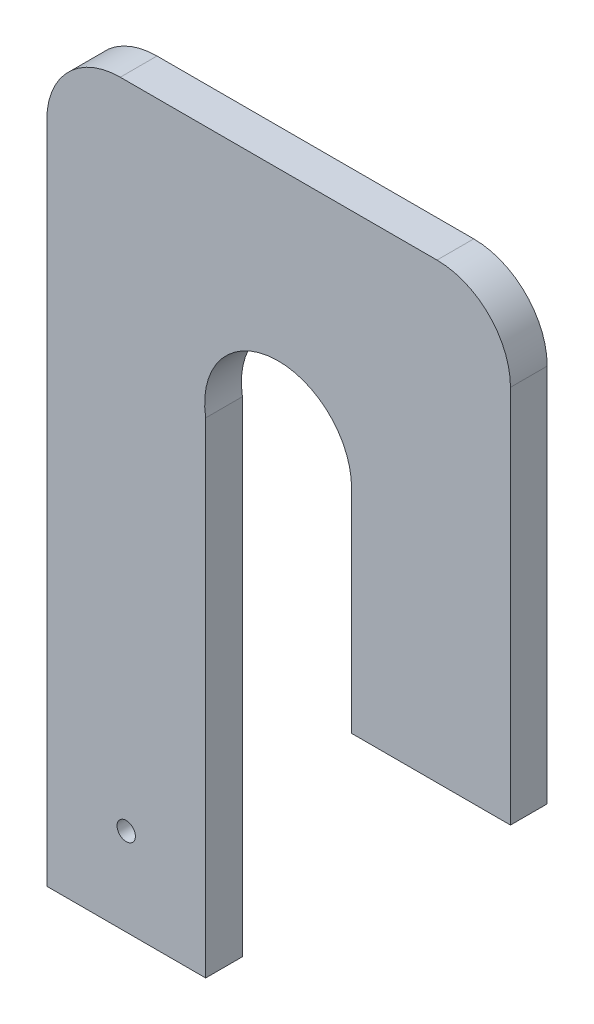
ISO-10303-21;
HEADER;
FILE_DESCRIPTION(('STEP AP214'),'2;1');
FILE_NAME('part.step','',(''),(''),'','','');
FILE_SCHEMA(('AUTOMOTIVE_DESIGN { 1 0 10303 214 1 1 1 1 }'));
ENDSEC;
DATA;
#1=APPLICATION_CONTEXT('core data for automotive mechanical design processes');
#2=APPLICATION_PROTOCOL_DEFINITION('international standard','automotive_design',2000,#1);
#3=PRODUCT_CONTEXT('',#1,'mechanical');
#4=PRODUCT('Part','Part','',(#3));
#5=PRODUCT_RELATED_PRODUCT_CATEGORY('part','',(#4));
#6=PRODUCT_DEFINITION_FORMATION('','',#4);
#7=PRODUCT_DEFINITION_CONTEXT('part definition',#1,'design');
#8=PRODUCT_DEFINITION('design','',#6,#7);
#9=PRODUCT_DEFINITION_SHAPE('','',#8);
#10=(LENGTH_UNIT() NAMED_UNIT(*) SI_UNIT(.MILLI.,.METRE.));
#11=(NAMED_UNIT(*) PLANE_ANGLE_UNIT() SI_UNIT($,.RADIAN.));
#12=(NAMED_UNIT(*) SI_UNIT($,.STERADIAN.) SOLID_ANGLE_UNIT());
#13=UNCERTAINTY_MEASURE_WITH_UNIT(LENGTH_MEASURE(1.E-05),#10,'distance_accuracy_value','');
#14=(GEOMETRIC_REPRESENTATION_CONTEXT(3) GLOBAL_UNCERTAINTY_ASSIGNED_CONTEXT((#13)) GLOBAL_UNIT_ASSIGNED_CONTEXT((#10,
#11,#12)) REPRESENTATION_CONTEXT('',''));
#15=CARTESIAN_POINT('',(0.,0.,0.));
#16=DIRECTION('',(0.,0.,1.));
#17=DIRECTION('',(1.,0.,0.));
#18=AXIS2_PLACEMENT_3D('',#15,#16,#17);
#19=CARTESIAN_POINT('',(25.0485915189549,171.916447250217,12.7));
#20=DIRECTION('',(0.,0.,-1.));
#21=DIRECTION('',(-1.,0.,0.));
#22=AXIS2_PLACEMENT_3D('',#19,#20,#21);
#23=CYLINDRICAL_SURFACE('',#22,25.4);
#24=CARTESIAN_POINT('',(25.0485915189549,171.916447250217,0.));
#25=DIRECTION('',(0.,0.,-1.));
#26=DIRECTION('',(-1.,0.,0.));
#27=AXIS2_PLACEMENT_3D('',#24,#25,#26);
#28=CIRCLE('',#27,25.4);
#29=CARTESIAN_POINT('',(0.,167.705976621351,0.));
#30=VERTEX_POINT('',#29);
#31=CARTESIAN_POINT('',(50.4485915189548,171.916447250217,0.));
#32=VERTEX_POINT('',#31);
#33=EDGE_CURVE('E141',#30,#32,#28,.T.);
#34=ORIENTED_EDGE('',*,*,#33,.T.);
#35=DIRECTION('',(0.,0.,-1.));
#36=VECTOR('',#35,1.);
#37=CARTESIAN_POINT('',(50.4485915189548,171.916447250217,12.7));
#38=LINE('',#37,#36);
#39=CARTESIAN_POINT('',(50.4485915189548,171.916447250217,12.7));
#40=VERTEX_POINT('',#39);
#41=EDGE_CURVE('E120',#40,#32,#38,.T.);
#42=ORIENTED_EDGE('',*,*,#41,.F.);
#43=CARTESIAN_POINT('',(25.0485915189549,171.916447250217,12.7));
#44=DIRECTION('',(0.,0.,-1.));
#45=DIRECTION('',(-1.,0.,0.));
#46=AXIS2_PLACEMENT_3D('',#43,#44,#45);
#47=CIRCLE('',#46,25.4);
#48=CARTESIAN_POINT('',(0.,167.705976621351,12.7));
#49=VERTEX_POINT('',#48);
#50=EDGE_CURVE('E128',#49,#40,#47,.T.);
#51=ORIENTED_EDGE('',*,*,#50,.F.);
#52=DIRECTION('',(0.,0.,-1.));
#53=VECTOR('',#52,1.);
#54=CARTESIAN_POINT('',(0.,167.705976621351,12.7));
#55=LINE('',#54,#53);
#56=EDGE_CURVE('E197',#49,#30,#55,.T.);
#57=ORIENTED_EDGE('',*,*,#56,.T.);
#58=EDGE_LOOP('',(#34,#42,#51,#57));
#59=FACE_BOUND('',#58,.T.);
#60=ADVANCED_FACE('F39',(#59),#23,.F.);
#61=CARTESIAN_POINT('',(50.4485915189548,171.916447250217,12.7));
#62=DIRECTION('',(1.,0.,0.));
#63=DIRECTION('',(0.,1.,0.));
#64=AXIS2_PLACEMENT_3D('',#61,#62,#63);
#65=PLANE('',#64);
#66=DIRECTION('',(0.,-1.,0.));
#67=VECTOR('',#66,1.);
#68=CARTESIAN_POINT('',(50.4485915189548,171.916447250217,0.));
#69=LINE('',#68,#67);
#70=CARTESIAN_POINT('',(50.4485915189549,98.4645123104404,0.));
#71=VERTEX_POINT('',#70);
#72=EDGE_CURVE('E217',#32,#71,#69,.T.);
#73=ORIENTED_EDGE('',*,*,#72,.T.);
#74=DIRECTION('',(0.,0.,-1.));
#75=VECTOR('',#74,1.);
#76=CARTESIAN_POINT('',(50.4485915189549,98.4645123104404,12.7));
#77=LINE('',#76,#75);
#78=CARTESIAN_POINT('',(50.4485915189549,98.4645123104404,12.7));
#79=VERTEX_POINT('',#78);
#80=EDGE_CURVE('E123',#79,#71,#77,.T.);
#81=ORIENTED_EDGE('',*,*,#80,.F.);
#82=DIRECTION('',(0.,-1.,0.));
#83=VECTOR('',#82,1.);
#84=CARTESIAN_POINT('',(50.4485915189548,171.916447250217,12.7));
#85=LINE('',#84,#83);
#86=EDGE_CURVE('E116',#40,#79,#85,.T.);
#87=ORIENTED_EDGE('',*,*,#86,.F.);
#88=ORIENTED_EDGE('',*,*,#41,.T.);
#89=EDGE_LOOP('',(#73,#81,#87,#88));
#90=FACE_BOUND('',#89,.T.);
#91=ADVANCED_FACE('F118',(#90),#65,.F.);
#92=CARTESIAN_POINT('',(50.4485915189549,98.4645123104404,12.7));
#93=DIRECTION('',(0.,1.,0.));
#94=DIRECTION('',(0.,0.,1.));
#95=AXIS2_PLACEMENT_3D('',#92,#93,#94);
#96=PLANE('',#95);
#97=DIRECTION('',(1.,0.,0.));
#98=VECTOR('',#97,1.);
#99=CARTESIAN_POINT('',(50.4485915189549,98.4645123104404,0.));
#100=LINE('',#99,#98);
#101=CARTESIAN_POINT('',(105.373327069566,98.4645123104404,0.));
#102=VERTEX_POINT('',#101);
#103=EDGE_CURVE('E189',#71,#102,#100,.T.);
#104=ORIENTED_EDGE('',*,*,#103,.T.);
#105=DIRECTION('',(0.,0.,-1.));
#106=VECTOR('',#105,1.);
#107=CARTESIAN_POINT('',(105.373327069566,98.4645123104404,12.7));
#108=LINE('',#107,#106);
#109=CARTESIAN_POINT('',(105.373327069566,98.4645123104404,12.7));
#110=VERTEX_POINT('',#109);
#111=EDGE_CURVE('E150',#110,#102,#108,.T.);
#112=ORIENTED_EDGE('',*,*,#111,.F.);
#113=DIRECTION('',(1.,0.,0.));
#114=VECTOR('',#113,1.);
#115=CARTESIAN_POINT('',(50.4485915189549,98.4645123104404,12.7));
#116=LINE('',#115,#114);
#117=EDGE_CURVE('E127',#79,#110,#116,.T.);
#118=ORIENTED_EDGE('',*,*,#117,.F.);
#119=ORIENTED_EDGE('',*,*,#80,.T.);
#120=EDGE_LOOP('',(#104,#112,#118,#119));
#121=FACE_BOUND('',#120,.T.);
#122=ADVANCED_FACE('F214',(#121),#96,.F.);
#123=CARTESIAN_POINT('',(105.373327069566,254.937244280116,12.7));
#124=DIRECTION('',(-1.,0.,0.));
#125=DIRECTION('',(0.,0.,1.));
#126=AXIS2_PLACEMENT_3D('',#123,#124,#125);
#127=PLANE('',#126);
#128=DIRECTION('',(0.,1.,0.));
#129=VECTOR('',#128,1.);
#130=CARTESIAN_POINT('',(105.373327069566,254.937244280116,0.));
#131=LINE('',#130,#129);
#132=CARTESIAN_POINT('',(105.373327069566,229.537244280116,0.));
#133=VERTEX_POINT('',#132);
#134=EDGE_CURVE('E183',#102,#133,#131,.T.);
#135=ORIENTED_EDGE('',*,*,#134,.T.);
#136=DIRECTION('',(0.,0.,-1.));
#137=VECTOR('',#136,1.);
#138=CARTESIAN_POINT('',(105.373327069566,229.537244280116,12.7));
#139=LINE('',#138,#137);
#140=CARTESIAN_POINT('',(105.373327069566,229.537244280116,12.7));
#141=VERTEX_POINT('',#140);
#142=EDGE_CURVE('E48',#133,#141,#139,.F.);
#143=ORIENTED_EDGE('',*,*,#142,.T.);
#144=DIRECTION('',(0.,1.,0.));
#145=VECTOR('',#144,1.);
#146=CARTESIAN_POINT('',(105.373327069566,98.4645123104404,12.7));
#147=LINE('',#146,#145);
#148=EDGE_CURVE('E211',#110,#141,#147,.T.);
#149=ORIENTED_EDGE('',*,*,#148,.F.);
#150=ORIENTED_EDGE('',*,*,#111,.T.);
#151=EDGE_LOOP('',(#135,#143,#149,#150));
#152=FACE_BOUND('',#151,.T.);
#153=ADVANCED_FACE('F210',(#152),#127,.F.);
#154=CARTESIAN_POINT('',(-54.9247355506111,254.937244280116,12.7));
#155=DIRECTION('',(0.,-1.,0.));
#156=DIRECTION('',(0.,0.,-1.));
#157=AXIS2_PLACEMENT_3D('',#154,#155,#156);
#158=PLANE('',#157);
#159=DIRECTION('',(-1.,0.,0.));
#160=VECTOR('',#159,1.);
#161=CARTESIAN_POINT('',(-54.9247355506111,254.937244280116,12.7));
#162=LINE('',#161,#160);
#163=CARTESIAN_POINT('',(79.9733270695659,254.937244280116,12.7));
#164=VERTEX_POINT('',#163);
#165=CARTESIAN_POINT('',(-29.5247355506111,254.937244280116,12.7));
#166=VERTEX_POINT('',#165);
#167=EDGE_CURVE('E175',#164,#166,#162,.T.);
#168=ORIENTED_EDGE('',*,*,#167,.F.);
#169=DIRECTION('',(0.,0.,-1.));
#170=VECTOR('',#169,1.);
#171=CARTESIAN_POINT('',(79.9733270695659,254.937244280116,12.7));
#172=LINE('',#171,#170);
#173=CARTESIAN_POINT('',(79.9733270695659,254.937244280116,0.));
#174=VERTEX_POINT('',#173);
#175=EDGE_CURVE('E164',#164,#174,#172,.T.);
#176=ORIENTED_EDGE('',*,*,#175,.T.);
#177=DIRECTION('',(-1.,0.,0.));
#178=VECTOR('',#177,1.);
#179=CARTESIAN_POINT('',(-54.9247355506111,254.937244280116,0.));
#180=LINE('',#179,#178);
#181=CARTESIAN_POINT('',(-29.5247355506111,254.937244280116,0.));
#182=VERTEX_POINT('',#181);
#183=EDGE_CURVE('E174',#174,#182,#180,.T.);
#184=ORIENTED_EDGE('',*,*,#183,.T.);
#185=DIRECTION('',(0.,0.,-1.));
#186=VECTOR('',#185,1.);
#187=CARTESIAN_POINT('',(-29.5247355506111,254.937244280116,12.7));
#188=LINE('',#187,#186);
#189=EDGE_CURVE('E157',#182,#166,#188,.F.);
#190=ORIENTED_EDGE('',*,*,#189,.T.);
#191=EDGE_LOOP('',(#168,#176,#184,#190));
#192=FACE_BOUND('',#191,.T.);
#193=ADVANCED_FACE('F173',(#192),#158,.F.);
#194=CARTESIAN_POINT('',(-54.9247355506111,254.937244280116,12.7));
#195=DIRECTION('',(1.,0.,0.));
#196=DIRECTION('',(0.,1.,0.));
#197=AXIS2_PLACEMENT_3D('',#194,#195,#196);
#198=PLANE('',#197);
#199=DIRECTION('',(0.,-1.,0.));
#200=VECTOR('',#199,1.);
#201=CARTESIAN_POINT('',(-54.9247355506111,254.937244280116,12.7));
#202=LINE('',#201,#200);
#203=CARTESIAN_POINT('',(-54.9247355506111,229.537244280116,12.7));
#204=VERTEX_POINT('',#203);
#205=CARTESIAN_POINT('',(-54.9247355506111,0.,12.7));
#206=VERTEX_POINT('',#205);
#207=EDGE_CURVE('E229',#204,#206,#202,.T.);
#208=ORIENTED_EDGE('',*,*,#207,.F.);
#209=DIRECTION('',(0.,0.,-1.));
#210=VECTOR('',#209,1.);
#211=CARTESIAN_POINT('',(-54.9247355506111,229.537244280116,12.7));
#212=LINE('',#211,#210);
#213=CARTESIAN_POINT('',(-54.9247355506111,229.537244280116,0.));
#214=VERTEX_POINT('',#213);
#215=EDGE_CURVE('E143',#204,#214,#212,.T.);
#216=ORIENTED_EDGE('',*,*,#215,.T.);
#217=DIRECTION('',(0.,-1.,0.));
#218=VECTOR('',#217,1.);
#219=CARTESIAN_POINT('',(-54.9247355506111,254.937244280116,0.));
#220=LINE('',#219,#218);
#221=CARTESIAN_POINT('',(-54.9247355506111,0.,0.));
#222=VERTEX_POINT('',#221);
#223=EDGE_CURVE('E182',#214,#222,#220,.T.);
#224=ORIENTED_EDGE('',*,*,#223,.T.);
#225=DIRECTION('',(0.,0.,-1.));
#226=VECTOR('',#225,1.);
#227=CARTESIAN_POINT('',(-54.9247355506111,0.,12.7));
#228=LINE('',#227,#226);
#229=EDGE_CURVE('E204',#206,#222,#228,.T.);
#230=ORIENTED_EDGE('',*,*,#229,.F.);
#231=EDGE_LOOP('',(#208,#216,#224,#230));
#232=FACE_BOUND('',#231,.T.);
#233=ADVANCED_FACE('F280',(#232),#198,.F.);
#234=CARTESIAN_POINT('',(0.,0.,12.7));
#235=DIRECTION('',(0.,1.,0.));
#236=DIRECTION('',(0.,0.,1.));
#237=AXIS2_PLACEMENT_3D('',#234,#235,#236);
#238=PLANE('',#237);
#239=DIRECTION('',(1.,0.,0.));
#240=VECTOR('',#239,1.);
#241=CARTESIAN_POINT('',(0.,0.,0.));
#242=LINE('',#241,#240);
#243=CARTESIAN_POINT('',(0.,0.,0.));
#244=VERTEX_POINT('',#243);
#245=EDGE_CURVE('E187',#222,#244,#242,.T.);
#246=ORIENTED_EDGE('',*,*,#245,.T.);
#247=DIRECTION('',(0.,0.,-1.));
#248=VECTOR('',#247,1.);
#249=CARTESIAN_POINT('',(0.,0.,12.7));
#250=LINE('',#249,#248);
#251=CARTESIAN_POINT('',(0.,0.,12.7));
#252=VERTEX_POINT('',#251);
#253=EDGE_CURVE('E200',#252,#244,#250,.T.);
#254=ORIENTED_EDGE('',*,*,#253,.F.);
#255=DIRECTION('',(1.,0.,0.));
#256=VECTOR('',#255,1.);
#257=CARTESIAN_POINT('',(0.,0.,12.7));
#258=LINE('',#257,#256);
#259=EDGE_CURVE('E226',#206,#252,#258,.T.);
#260=ORIENTED_EDGE('',*,*,#259,.F.);
#261=ORIENTED_EDGE('',*,*,#229,.T.);
#262=EDGE_LOOP('',(#246,#254,#260,#261));
#263=FACE_BOUND('',#262,.T.);
#264=ADVANCED_FACE('F259',(#263),#238,.F.);
#265=CARTESIAN_POINT('',(0.,167.705976621351,12.7));
#266=DIRECTION('',(-1.,0.,0.));
#267=DIRECTION('',(0.,-1.,0.));
#268=AXIS2_PLACEMENT_3D('',#265,#266,#267);
#269=PLANE('',#268);
#270=DIRECTION('',(0.,1.,0.));
#271=VECTOR('',#270,1.);
#272=CARTESIAN_POINT('',(0.,167.705976621351,0.));
#273=LINE('',#272,#271);
#274=EDGE_CURVE('E138',#244,#30,#273,.T.);
#275=ORIENTED_EDGE('',*,*,#274,.T.);
#276=ORIENTED_EDGE('',*,*,#56,.F.);
#277=DIRECTION('',(0.,1.,0.));
#278=VECTOR('',#277,1.);
#279=CARTESIAN_POINT('',(0.,167.705976621351,12.7));
#280=LINE('',#279,#278);
#281=EDGE_CURVE('E133',#252,#49,#280,.T.);
#282=ORIENTED_EDGE('',*,*,#281,.F.);
#283=ORIENTED_EDGE('',*,*,#253,.T.);
#284=EDGE_LOOP('',(#275,#276,#282,#283));
#285=FACE_BOUND('',#284,.T.);
#286=ADVANCED_FACE('F250',(#285),#269,.F.);
#287=CARTESIAN_POINT('',(25.0485915189549,171.916447250217,12.7));
#288=DIRECTION('',(0.,0.,-1.));
#289=DIRECTION('',(-1.,0.,0.));
#290=AXIS2_PLACEMENT_3D('',#287,#288,#289);
#291=PLANE('',#290);
#292=CARTESIAN_POINT('',(-27.4623677753055,30.2624011596046,12.7));
#293=DIRECTION('',(0.,0.,1.));
#294=DIRECTION('',(1.,0.,0.));
#295=AXIS2_PLACEMENT_3D('',#292,#293,#294);
#296=CIRCLE('',#295,3.175);
#297=CARTESIAN_POINT('',(-24.2873677753055,30.2624011596046,12.7));
#298=VERTEX_POINT('',#297);
#299=EDGE_CURVE('E241',#298,#298,#296,.T.);
#300=ORIENTED_EDGE('',*,*,#299,.F.);
#301=EDGE_LOOP('',(#300));
#302=FACE_BOUND('',#301,.T.);
#303=ORIENTED_EDGE('',*,*,#148,.T.);
#304=CARTESIAN_POINT('',(79.9733270695659,229.537244280116,12.7));
#305=DIRECTION('',(0.,0.,-1.));
#306=DIRECTION('',(-1.,0.,0.));
#307=AXIS2_PLACEMENT_3D('',#304,#305,#306);
#308=CIRCLE('',#307,25.4);
#309=EDGE_CURVE('E11',#141,#164,#308,.F.);
#310=ORIENTED_EDGE('',*,*,#309,.T.);
#311=ORIENTED_EDGE('',*,*,#167,.T.);
#312=CARTESIAN_POINT('',(-29.5247355506111,229.537244280116,12.7));
#313=DIRECTION('',(0.,0.,-1.));
#314=DIRECTION('',(-1.,0.,0.));
#315=AXIS2_PLACEMENT_3D('',#312,#313,#314);
#316=CIRCLE('',#315,25.4);
#317=EDGE_CURVE('E161',#166,#204,#316,.F.);
#318=ORIENTED_EDGE('',*,*,#317,.T.);
#319=ORIENTED_EDGE('',*,*,#207,.T.);
#320=ORIENTED_EDGE('',*,*,#259,.T.);
#321=ORIENTED_EDGE('',*,*,#281,.T.);
#322=ORIENTED_EDGE('',*,*,#50,.T.);
#323=ORIENTED_EDGE('',*,*,#86,.T.);
#324=ORIENTED_EDGE('',*,*,#117,.T.);
#325=EDGE_LOOP('',(#303,#310,#311,#318,#319,#320,#321,#322,#323,#324));
#326=FACE_BOUND('',#325,.T.);
#327=ADVANCED_FACE('F131',(#302,#326),#291,.F.);
#328=CARTESIAN_POINT('',(25.0485915189549,171.916447250217,0.));
#329=DIRECTION('',(0.,0.,-1.));
#330=DIRECTION('',(-1.,0.,0.));
#331=AXIS2_PLACEMENT_3D('',#328,#329,#330);
#332=PLANE('',#331);
#333=CARTESIAN_POINT('',(-27.4623677753055,30.2624011596046,0.));
#334=DIRECTION('',(0.,0.,-1.));
#335=DIRECTION('',(-1.,0.,0.));
#336=AXIS2_PLACEMENT_3D('',#333,#334,#335);
#337=CIRCLE('',#336,3.175);
#338=CARTESIAN_POINT('',(-24.2873677753055,30.2624011596046,0.));
#339=VERTEX_POINT('',#338);
#340=EDGE_CURVE('E223',#339,#339,#337,.F.);
#341=ORIENTED_EDGE('',*,*,#340,.T.);
#342=EDGE_LOOP('',(#341));
#343=FACE_BOUND('',#342,.T.);
#344=ORIENTED_EDGE('',*,*,#183,.F.);
#345=CARTESIAN_POINT('',(79.9733270695659,229.537244280116,0.));
#346=DIRECTION('',(0.,0.,-1.));
#347=DIRECTION('',(-1.,0.,0.));
#348=AXIS2_PLACEMENT_3D('',#345,#346,#347);
#349=CIRCLE('',#348,25.4);
#350=EDGE_CURVE('E62',#174,#133,#349,.T.);
#351=ORIENTED_EDGE('',*,*,#350,.T.);
#352=ORIENTED_EDGE('',*,*,#134,.F.);
#353=ORIENTED_EDGE('',*,*,#103,.F.);
#354=ORIENTED_EDGE('',*,*,#72,.F.);
#355=ORIENTED_EDGE('',*,*,#33,.F.);
#356=ORIENTED_EDGE('',*,*,#274,.F.);
#357=ORIENTED_EDGE('',*,*,#245,.F.);
#358=ORIENTED_EDGE('',*,*,#223,.F.);
#359=CARTESIAN_POINT('',(-29.5247355506111,229.537244280116,0.));
#360=DIRECTION('',(0.,0.,-1.));
#361=DIRECTION('',(-1.,0.,0.));
#362=AXIS2_PLACEMENT_3D('',#359,#360,#361);
#363=CIRCLE('',#362,25.4);
#364=EDGE_CURVE('E148',#214,#182,#363,.T.);
#365=ORIENTED_EDGE('',*,*,#364,.T.);
#366=EDGE_LOOP('',(#344,#351,#352,#353,#354,#355,#356,#357,#358,#365));
#367=FACE_BOUND('',#366,.T.);
#368=ADVANCED_FACE('F178',(#343,#367),#332,.T.);
#369=CARTESIAN_POINT('',(-29.5247355506111,229.537244280116,12.7));
#370=DIRECTION('',(0.,0.,-1.));
#371=DIRECTION('',(-1.,0.,0.));
#372=AXIS2_PLACEMENT_3D('',#369,#370,#371);
#373=CYLINDRICAL_SURFACE('',#372,25.4);
#374=ORIENTED_EDGE('',*,*,#317,.F.);
#375=ORIENTED_EDGE('',*,*,#189,.F.);
#376=ORIENTED_EDGE('',*,*,#364,.F.);
#377=ORIENTED_EDGE('',*,*,#215,.F.);
#378=EDGE_LOOP('',(#374,#375,#376,#377));
#379=FACE_BOUND('',#378,.T.);
#380=ADVANCED_FACE('F256',(#379),#373,.T.);
#381=CARTESIAN_POINT('',(79.9733270695659,229.537244280116,12.7));
#382=DIRECTION('',(0.,0.,-1.));
#383=DIRECTION('',(-1.,0.,0.));
#384=AXIS2_PLACEMENT_3D('',#381,#382,#383);
#385=CYLINDRICAL_SURFACE('',#384,25.4);
#386=ORIENTED_EDGE('',*,*,#309,.F.);
#387=ORIENTED_EDGE('',*,*,#142,.F.);
#388=ORIENTED_EDGE('',*,*,#350,.F.);
#389=ORIENTED_EDGE('',*,*,#175,.F.);
#390=EDGE_LOOP('',(#386,#387,#388,#389));
#391=FACE_BOUND('',#390,.T.);
#392=ADVANCED_FACE('F41',(#391),#385,.T.);
#393=CARTESIAN_POINT('',(-27.4623677753055,30.2624011596046,-8.98025612106916));
#394=DIRECTION('',(0.,0.,1.));
#395=DIRECTION('',(1.,0.,0.));
#396=AXIS2_PLACEMENT_3D('',#393,#394,#395);
#397=CYLINDRICAL_SURFACE('',#396,3.175);
#398=CARTESIAN_POINT('',(-24.2873677753055,30.2624011596046,12.7));
#399=CARTESIAN_POINT('',(-24.2873677753055,30.2624011596046,12.5677083333333));
#400=CARTESIAN_POINT('',(-24.2873677753055,30.2624011596046,12.4354166666667));
#401=CARTESIAN_POINT('',(-24.2873677753055,30.2624011596046,12.1708333333333));
#402=CARTESIAN_POINT('',(-24.2873677753055,30.2624011596046,12.0385416666667));
#403=CARTESIAN_POINT('',(-24.2873677753055,30.2624011596046,11.7739583333333));
#404=CARTESIAN_POINT('',(-24.2873677753055,30.2624011596046,11.6416666666667));
#405=CARTESIAN_POINT('',(-24.2873677753055,30.2624011596046,11.3770833333333));
#406=CARTESIAN_POINT('',(-24.2873677753055,30.2624011596046,11.2447916666667));
#407=CARTESIAN_POINT('',(-24.2873677753055,30.2624011596046,10.9802083333333));
#408=CARTESIAN_POINT('',(-24.2873677753055,30.2624011596046,10.8479166666667));
#409=CARTESIAN_POINT('',(-24.2873677753055,30.2624011596046,10.5833333333333));
#410=CARTESIAN_POINT('',(-24.2873677753055,30.2624011596046,10.4510416666667));
#411=CARTESIAN_POINT('',(-24.2873677753055,30.2624011596046,10.1864583333333));
#412=CARTESIAN_POINT('',(-24.2873677753055,30.2624011596046,10.0541666666667));
#413=CARTESIAN_POINT('',(-24.2873677753055,30.2624011596046,9.78958333333333));
#414=CARTESIAN_POINT('',(-24.2873677753055,30.2624011596046,9.65729166666666));
#415=CARTESIAN_POINT('',(-24.2873677753055,30.2624011596046,9.39270833333333));
#416=CARTESIAN_POINT('',(-24.2873677753055,30.2624011596046,9.26041666666666));
#417=CARTESIAN_POINT('',(-24.2873677753055,30.2624011596046,8.99583333333333));
#418=CARTESIAN_POINT('',(-24.2873677753055,30.2624011596046,8.86354166666666));
#419=CARTESIAN_POINT('',(-24.2873677753055,30.2624011596046,8.59895833333333));
#420=CARTESIAN_POINT('',(-24.2873677753055,30.2624011596046,8.46666666666666));
#421=CARTESIAN_POINT('',(-24.2873677753055,30.2624011596046,8.20208333333333));
#422=CARTESIAN_POINT('',(-24.2873677753055,30.2624011596046,8.06979166666666));
#423=CARTESIAN_POINT('',(-24.2873677753055,30.2624011596046,7.80520833333333));
#424=CARTESIAN_POINT('',(-24.2873677753055,30.2624011596046,7.67291666666666));
#425=CARTESIAN_POINT('',(-24.2873677753055,30.2624011596046,7.40833333333333));
#426=CARTESIAN_POINT('',(-24.2873677753055,30.2624011596046,7.27604166666666));
#427=CARTESIAN_POINT('',(-24.2873677753055,30.2624011596046,7.01145833333333));
#428=CARTESIAN_POINT('',(-24.2873677753055,30.2624011596046,6.87916666666667));
#429=CARTESIAN_POINT('',(-24.2873677753055,30.2624011596046,6.61458333333333));
#430=CARTESIAN_POINT('',(-24.2873677753055,30.2624011596046,6.48229166666667));
#431=CARTESIAN_POINT('',(-24.2873677753055,30.2624011596046,6.21770833333333));
#432=CARTESIAN_POINT('',(-24.2873677753055,30.2624011596046,6.08541666666667));
#433=CARTESIAN_POINT('',(-24.2873677753055,30.2624011596046,5.82083333333333));
#434=CARTESIAN_POINT('',(-24.2873677753055,30.2624011596046,5.68854166666667));
#435=CARTESIAN_POINT('',(-24.2873677753055,30.2624011596046,5.42395833333333));
#436=CARTESIAN_POINT('',(-24.2873677753055,30.2624011596046,5.29166666666667));
#437=CARTESIAN_POINT('',(-24.2873677753055,30.2624011596046,5.02708333333333));
#438=CARTESIAN_POINT('',(-24.2873677753055,30.2624011596046,4.89479166666667));
#439=CARTESIAN_POINT('',(-24.2873677753055,30.2624011596046,4.63020833333333));
#440=CARTESIAN_POINT('',(-24.2873677753055,30.2624011596046,4.49791666666667));
#441=CARTESIAN_POINT('',(-24.2873677753055,30.2624011596046,4.23333333333333));
#442=CARTESIAN_POINT('',(-24.2873677753055,30.2624011596046,4.10104166666667));
#443=CARTESIAN_POINT('',(-24.2873677753055,30.2624011596046,3.83645833333333));
#444=CARTESIAN_POINT('',(-24.2873677753055,30.2624011596046,3.70416666666667));
#445=CARTESIAN_POINT('',(-24.2873677753055,30.2624011596046,3.43958333333333));
#446=CARTESIAN_POINT('',(-24.2873677753055,30.2624011596046,3.30729166666667));
#447=CARTESIAN_POINT('',(-24.2873677753055,30.2624011596046,3.04270833333333));
#448=CARTESIAN_POINT('',(-24.2873677753055,30.2624011596046,2.91041666666667));
#449=CARTESIAN_POINT('',(-24.2873677753055,30.2624011596046,2.64583333333333));
#450=CARTESIAN_POINT('',(-24.2873677753055,30.2624011596046,2.51354166666667));
#451=CARTESIAN_POINT('',(-24.2873677753055,30.2624011596046,2.24895833333334));
#452=CARTESIAN_POINT('',(-24.2873677753055,30.2624011596046,2.11666666666667));
#453=CARTESIAN_POINT('',(-24.2873677753055,30.2624011596046,1.85208333333333));
#454=CARTESIAN_POINT('',(-24.2873677753055,30.2624011596046,1.71979166666667));
#455=CARTESIAN_POINT('',(-24.2873677753055,30.2624011596046,1.45520833333333));
#456=CARTESIAN_POINT('',(-24.2873677753055,30.2624011596046,1.32291666666667));
#457=CARTESIAN_POINT('',(-24.2873677753055,30.2624011596046,1.05833333333333));
#458=CARTESIAN_POINT('',(-24.2873677753055,30.2624011596046,0.926041666666668));
#459=CARTESIAN_POINT('',(-24.2873677753055,30.2624011596046,0.661458333333334));
#460=CARTESIAN_POINT('',(-24.2873677753055,30.2624011596046,0.529166666666668));
#461=CARTESIAN_POINT('',(-24.2873677753055,30.2624011596046,0.264583333333335));
#462=CARTESIAN_POINT('',(-24.2873677753055,30.2624011596046,0.132291666666668));
#463=CARTESIAN_POINT('',(-24.2873677753055,30.2624011596046,0.));
#464=B_SPLINE_CURVE_WITH_KNOTS('',3,(#398,#399,#400,#401,#402,#403,#404,#405,#406,#407,#408,
#409,#410,#411,#412,#413,#414,#415,#416,#417,#418,#419,#420,#421,#422,#423,#424,#425,#426,#427,
#428,#429,#430,#431,#432,#433,#434,#435,#436,#437,#438,#439,#440,#441,#442,#443,#444,#445,#446,
#447,#448,#449,#450,#451,#452,#453,#454,#455,#456,#457,#458,#459,#460,#461,#462,#463),
.UNSPECIFIED.,.F.,.F.,(4,2,2,2,2,2,2,2,2,2,2,2,2,2,2,2,2,2,2,2,2,2,2,2,2,2,2,2,2,2,2,2,4),(0.,
0.396875000000001,0.793749999999999,1.190625,1.5875,1.984375,2.38125,2.778125,3.175,3.571875,
3.96875,4.365625,4.7625,5.159375,5.55625,5.953125,6.35,6.746875,7.14375,7.540625,
7.93749999999999,8.334375,8.73125,9.128125,9.525,9.92187499999999,10.31875,10.715625,11.1125,
11.509375,11.90625,12.303125,12.7),.UNSPECIFIED.);
#465=EDGE_CURVE('BSEAM246',#298,#339,#464,.T.);
#466=ORIENTED_EDGE('',*,*,#299,.T.);
#467=ORIENTED_EDGE('',*,*,#340,.F.);
#468=ORIENTED_EDGE('',*,*,#465,.T.);
#469=ORIENTED_EDGE('',*,*,#465,.F.);
#470=EDGE_LOOP('',(#466,#468,#467,#469));
#471=FACE_BOUND('',#470,.T.);
#472=ADVANCED_FACE('F246',(#471),#397,.F.);
#473=CLOSED_SHELL('',(#60,#91,#122,#153,#193,#233,#264,#286,#327,#368,#380,#392,#472));
#474=MANIFOLD_SOLID_BREP('B2',#473);
#475=ADVANCED_BREP_SHAPE_REPRESENTATION('',(#18,#474),#14);
#476=SHAPE_DEFINITION_REPRESENTATION(#9,#475);
ENDSEC;
END-ISO-10303-21;
